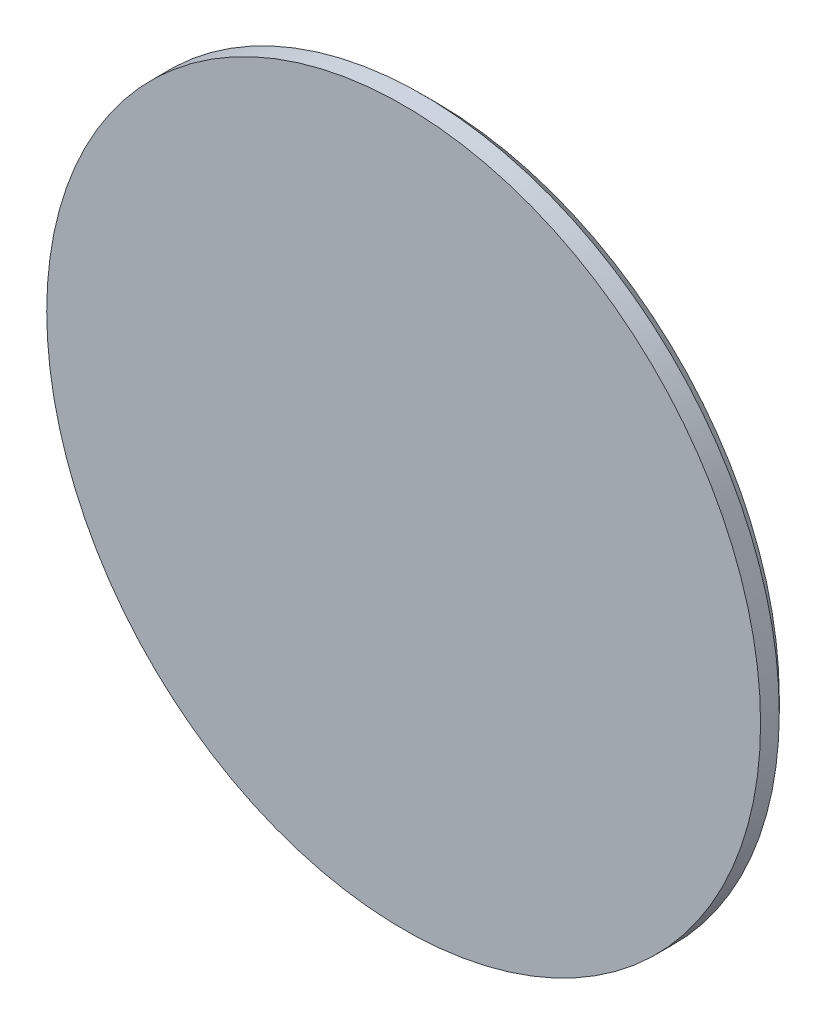
ISO-10303-21;
HEADER;
FILE_DESCRIPTION(('STEP AP214'),'2;1');
FILE_NAME('part.step','',(''),(''),'','','');
FILE_SCHEMA(('AUTOMOTIVE_DESIGN { 1 0 10303 214 1 1 1 1 }'));
ENDSEC;
DATA;
#1=APPLICATION_CONTEXT('core data for automotive mechanical design processes');
#2=APPLICATION_PROTOCOL_DEFINITION('international standard','automotive_design',2000,#1);
#3=PRODUCT_CONTEXT('',#1,'mechanical');
#4=PRODUCT('Part','Part','',(#3));
#5=PRODUCT_RELATED_PRODUCT_CATEGORY('part','',(#4));
#6=PRODUCT_DEFINITION_FORMATION('','',#4);
#7=PRODUCT_DEFINITION_CONTEXT('part definition',#1,'design');
#8=PRODUCT_DEFINITION('design','',#6,#7);
#9=PRODUCT_DEFINITION_SHAPE('','',#8);
#10=(LENGTH_UNIT() NAMED_UNIT(*) SI_UNIT(.MILLI.,.METRE.));
#11=(NAMED_UNIT(*) PLANE_ANGLE_UNIT() SI_UNIT($,.RADIAN.));
#12=(NAMED_UNIT(*) SI_UNIT($,.STERADIAN.) SOLID_ANGLE_UNIT());
#13=UNCERTAINTY_MEASURE_WITH_UNIT(LENGTH_MEASURE(1.E-05),#10,'distance_accuracy_value','');
#14=(GEOMETRIC_REPRESENTATION_CONTEXT(3) GLOBAL_UNCERTAINTY_ASSIGNED_CONTEXT((#13)) GLOBAL_UNIT_ASSIGNED_CONTEXT((#10,
#11,#12)) REPRESENTATION_CONTEXT('',''));
#15=CARTESIAN_POINT('',(0.,0.,0.));
#16=DIRECTION('',(0.,0.,1.));
#17=DIRECTION('',(1.,0.,0.));
#18=AXIS2_PLACEMENT_3D('',#15,#16,#17);
#19=CARTESIAN_POINT('',(-27.4346994423093,18.3395001706741,3.));
#20=DIRECTION('',(0.,0.,-1.));
#21=DIRECTION('',(-1.,0.,0.));
#22=AXIS2_PLACEMENT_3D('',#19,#20,#21);
#23=CYLINDRICAL_SURFACE('',#22,33.);
#24=CARTESIAN_POINT('',(-27.4346994423093,18.3395001706741,1.27));
#25=DIRECTION('',(0.,0.,1.));
#26=DIRECTION('',(1.,0.,0.));
#27=AXIS2_PLACEMENT_3D('',#24,#25,#26);
#28=CIRCLE('',#27,33.);
#29=CARTESIAN_POINT('',(5.56530055769074,18.3395001706741,1.27));
#30=VERTEX_POINT('',#29);
#31=EDGE_CURVE('E46',#30,#30,#28,.T.);
#32=ORIENTED_EDGE('',*,*,#31,.T.);
#33=EDGE_LOOP('',(#32));
#34=FACE_BOUND('',#33,.T.);
#35=CARTESIAN_POINT('',(-27.4346994423093,18.3395001706741,3.));
#36=DIRECTION('',(0.,0.,1.));
#37=DIRECTION('',(1.,0.,0.));
#38=AXIS2_PLACEMENT_3D('',#35,#36,#37);
#39=CIRCLE('',#38,33.);
#40=CARTESIAN_POINT('',(5.56530055769074,18.3395001706741,3.));
#41=VERTEX_POINT('',#40);
#42=EDGE_CURVE('E50',#41,#41,#39,.T.);
#43=ORIENTED_EDGE('',*,*,#42,.F.);
#44=EDGE_LOOP('',(#43));
#45=FACE_BOUND('',#44,.T.);
#46=ADVANCED_FACE('F38',(#34,#45),#23,.T.);
#47=CARTESIAN_POINT('',(-27.4346994423093,18.3395001706741,3.));
#48=DIRECTION('',(0.,0.,1.));
#49=DIRECTION('',(1.,0.,0.));
#50=AXIS2_PLACEMENT_3D('',#47,#48,#49);
#51=PLANE('',#50);
#52=ORIENTED_EDGE('',*,*,#42,.T.);
#53=EDGE_LOOP('',(#52));
#54=FACE_BOUND('',#53,.T.);
#55=ADVANCED_FACE('F57',(#54),#51,.T.);
#56=CARTESIAN_POINT('',(-27.4346994423093,18.3395001706741,0.));
#57=DIRECTION('',(0.,0.,1.));
#58=DIRECTION('',(1.,0.,0.));
#59=AXIS2_PLACEMENT_3D('',#56,#57,#58);
#60=PLANE('',#59);
#61=CARTESIAN_POINT('',(-27.4346994423093,18.3395001706741,0.));
#62=DIRECTION('',(0.,0.,1.));
#63=DIRECTION('',(1.,0.,0.));
#64=AXIS2_PLACEMENT_3D('',#61,#62,#63);
#65=CIRCLE('',#64,31.73);
#66=CARTESIAN_POINT('',(4.29530055769074,18.3395001706741,0.));
#67=VERTEX_POINT('',#66);
#68=EDGE_CURVE('E10',#67,#67,#65,.F.);
#69=ORIENTED_EDGE('',*,*,#68,.T.);
#70=EDGE_LOOP('',(#69));
#71=FACE_BOUND('',#70,.T.);
#72=ADVANCED_FACE('F63',(#71),#60,.F.);
#73=CARTESIAN_POINT('',(-27.4346994423093,18.3395001706741,1.27));
#74=DIRECTION('',(0.,0.,1.));
#75=DIRECTION('',(1.,0.,0.));
#76=AXIS2_PLACEMENT_3D('',#73,#74,#75);
#77=CONICAL_SURFACE('',#76,33.,0.785398163397448);
#78=ORIENTED_EDGE('',*,*,#68,.F.);
#79=EDGE_LOOP('',(#78));
#80=FACE_BOUND('',#79,.T.);
#81=ORIENTED_EDGE('',*,*,#31,.F.);
#82=EDGE_LOOP('',(#81));
#83=FACE_BOUND('',#82,.T.);
#84=ADVANCED_FACE('F41',(#80,#83),#77,.T.);
#85=CLOSED_SHELL('',(#46,#55,#72,#84));
#86=MANIFOLD_SOLID_BREP('B2',#85);
#87=ADVANCED_BREP_SHAPE_REPRESENTATION('',(#18,#86),#14);
#88=SHAPE_DEFINITION_REPRESENTATION(#9,#87);
ENDSEC;
END-ISO-10303-21;
